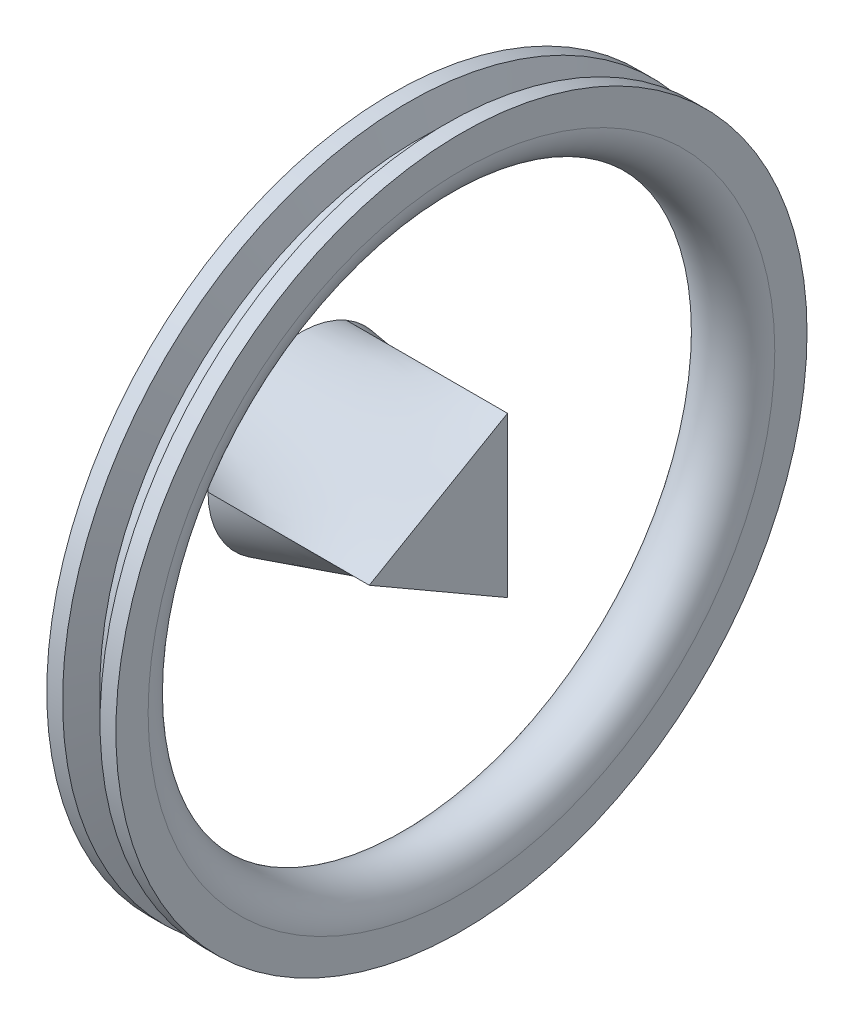
ISO-10303-21;
HEADER;
FILE_DESCRIPTION(('STEP AP214'),'2;1');
FILE_NAME('part.step','',(''),(''),'','','');
FILE_SCHEMA(('AUTOMOTIVE_DESIGN { 1 0 10303 214 1 1 1 1 }'));
ENDSEC;
DATA;
#1=APPLICATION_CONTEXT('core data for automotive mechanical design processes');
#2=APPLICATION_PROTOCOL_DEFINITION('international standard','automotive_design',2000,#1);
#3=PRODUCT_CONTEXT('',#1,'mechanical');
#4=PRODUCT('Part','Part','',(#3));
#5=PRODUCT_RELATED_PRODUCT_CATEGORY('part','',(#4));
#6=PRODUCT_DEFINITION_FORMATION('','',#4);
#7=PRODUCT_DEFINITION_CONTEXT('part definition',#1,'design');
#8=PRODUCT_DEFINITION('design','',#6,#7);
#9=PRODUCT_DEFINITION_SHAPE('','',#8);
#10=(LENGTH_UNIT() NAMED_UNIT(*) SI_UNIT(.MILLI.,.METRE.));
#11=(NAMED_UNIT(*) PLANE_ANGLE_UNIT() SI_UNIT($,.RADIAN.));
#12=(NAMED_UNIT(*) SI_UNIT($,.STERADIAN.) SOLID_ANGLE_UNIT());
#13=UNCERTAINTY_MEASURE_WITH_UNIT(LENGTH_MEASURE(1.E-05),#10,'distance_accuracy_value','');
#14=(GEOMETRIC_REPRESENTATION_CONTEXT(3) GLOBAL_UNCERTAINTY_ASSIGNED_CONTEXT((#13)) GLOBAL_UNIT_ASSIGNED_CONTEXT((#10,
#11,#12)) REPRESENTATION_CONTEXT('',''));
#15=CARTESIAN_POINT('',(0.,0.,0.));
#16=DIRECTION('',(0.,0.,1.));
#17=DIRECTION('',(1.,0.,0.));
#18=AXIS2_PLACEMENT_3D('',#15,#16,#17);
#19=CARTESIAN_POINT('',(20.,0.,75.));
#20=DIRECTION('',(1.,0.,0.));
#21=DIRECTION('',(0.,0.,-1.));
#22=AXIS2_PLACEMENT_3D('',#19,#20,#21);
#23=PLANE('',#22);
#24=CARTESIAN_POINT('',(20.,0.,0.));
#25=DIRECTION('',(1.,0.,0.));
#26=DIRECTION('',(0.,0.,-1.));
#27=AXIS2_PLACEMENT_3D('',#24,#25,#26);
#28=CIRCLE('',#27,75.);
#29=CARTESIAN_POINT('',(20.,0.,-75.));
#30=VERTEX_POINT('',#29);
#31=EDGE_CURVE('E92',#30,#30,#28,.T.);
#32=ORIENTED_EDGE('',*,*,#31,.F.);
#33=EDGE_LOOP('',(#32));
#34=FACE_BOUND('',#33,.T.);
#35=CARTESIAN_POINT('',(20.,0.,0.));
#36=DIRECTION('',(1.,0.,0.));
#37=DIRECTION('',(0.,0.,-1.));
#38=AXIS2_PLACEMENT_3D('',#35,#36,#37);
#39=CIRCLE('',#38,68.);
#40=CARTESIAN_POINT('',(20.,0.,-68.));
#41=VERTEX_POINT('',#40);
#42=EDGE_CURVE('E12',#41,#41,#39,.T.);
#43=ORIENTED_EDGE('',*,*,#42,.T.);
#44=EDGE_LOOP('',(#43));
#45=FACE_BOUND('',#44,.T.);
#46=ADVANCED_FACE('F64',(#34,#45),#23,.F.);
#47=CARTESIAN_POINT('',(27.5,0.,0.));
#48=DIRECTION('',(1.,0.,0.));
#49=DIRECTION('',(0.,0.,-1.));
#50=AXIS2_PLACEMENT_3D('',#47,#48,#49);
#51=TOROIDAL_SURFACE('',#50,68.,7.5);
#52=ORIENTED_EDGE('',*,*,#42,.F.);
#53=EDGE_LOOP('',(#52));
#54=FACE_BOUND('',#53,.T.);
#55=CARTESIAN_POINT('',(35.,0.,0.));
#56=DIRECTION('',(1.,0.,0.));
#57=DIRECTION('',(0.,0.,-1.));
#58=AXIS2_PLACEMENT_3D('',#55,#56,#57);
#59=CIRCLE('',#58,68.);
#60=CARTESIAN_POINT('',(35.,0.,-68.));
#61=VERTEX_POINT('',#60);
#62=EDGE_CURVE('E70',#61,#61,#59,.T.);
#63=ORIENTED_EDGE('',*,*,#62,.T.);
#64=EDGE_LOOP('',(#63));
#65=FACE_BOUND('',#64,.T.);
#66=ADVANCED_FACE('F99',(#54,#65),#51,.T.);
#67=CARTESIAN_POINT('',(35.,0.,75.));
#68=DIRECTION('',(-1.,0.,0.));
#69=DIRECTION('',(0.,0.,1.));
#70=AXIS2_PLACEMENT_3D('',#67,#68,#69);
#71=PLANE('',#70);
#72=ORIENTED_EDGE('',*,*,#62,.F.);
#73=EDGE_LOOP('',(#72));
#74=FACE_BOUND('',#73,.T.);
#75=CARTESIAN_POINT('',(35.,0.,0.));
#76=DIRECTION('',(1.,0.,0.));
#77=DIRECTION('',(0.,0.,-1.));
#78=AXIS2_PLACEMENT_3D('',#75,#76,#77);
#79=CIRCLE('',#78,75.);
#80=CARTESIAN_POINT('',(35.,0.,-75.));
#81=VERTEX_POINT('',#80);
#82=EDGE_CURVE('E74',#81,#81,#79,.T.);
#83=ORIENTED_EDGE('',*,*,#82,.T.);
#84=EDGE_LOOP('',(#83));
#85=FACE_BOUND('',#84,.T.);
#86=ADVANCED_FACE('F103',(#74,#85),#71,.F.);
#87=CARTESIAN_POINT('',(47.8941825318175,0.,0.));
#88=DIRECTION('',(1.,0.,0.));
#89=DIRECTION('',(0.,0.,-1.));
#90=AXIS2_PLACEMENT_3D('',#87,#88,#89);
#91=CYLINDRICAL_SURFACE('',#90,75.);
#92=ORIENTED_EDGE('',*,*,#82,.F.);
#93=EDGE_LOOP('',(#92));
#94=FACE_BOUND('',#93,.T.);
#95=CARTESIAN_POINT('',(31.565965679738,0.,0.));
#96=DIRECTION('',(1.,0.,0.));
#97=DIRECTION('',(0.,0.,-1.));
#98=AXIS2_PLACEMENT_3D('',#95,#96,#97);
#99=CIRCLE('',#98,75.);
#100=CARTESIAN_POINT('',(31.565965679738,0.,-75.));
#101=VERTEX_POINT('',#100);
#102=EDGE_CURVE('E78',#101,#101,#99,.T.);
#103=ORIENTED_EDGE('',*,*,#102,.T.);
#104=EDGE_LOOP('',(#103));
#105=FACE_BOUND('',#104,.T.);
#106=ADVANCED_FACE('F108',(#94,#105),#91,.T.);
#107=CARTESIAN_POINT('',(29.5,0.,0.));
#108=DIRECTION('',(1.,0.,0.));
#109=DIRECTION('',(0.,0.,-1.));
#110=AXIS2_PLACEMENT_3D('',#107,#108,#109);
#111=CONICAL_SURFACE('',#110,69.,1.23918376891598);
#112=ORIENTED_EDGE('',*,*,#102,.F.);
#113=EDGE_LOOP('',(#112));
#114=FACE_BOUND('',#113,.T.);
#115=CARTESIAN_POINT('',(29.5,0.,0.));
#116=DIRECTION('',(1.,0.,0.));
#117=DIRECTION('',(0.,0.,-1.));
#118=AXIS2_PLACEMENT_3D('',#115,#116,#117);
#119=CIRCLE('',#118,69.);
#120=CARTESIAN_POINT('',(29.5,0.,-69.));
#121=VERTEX_POINT('',#120);
#122=EDGE_CURVE('E83',#121,#121,#119,.T.);
#123=ORIENTED_EDGE('',*,*,#122,.T.);
#124=EDGE_LOOP('',(#123));
#125=FACE_BOUND('',#124,.T.);
#126=ADVANCED_FACE('F114',(#114,#125),#111,.T.);
#127=CARTESIAN_POINT('',(47.8941825318175,0.,0.));
#128=DIRECTION('',(1.,0.,0.));
#129=DIRECTION('',(0.,0.,-1.));
#130=AXIS2_PLACEMENT_3D('',#127,#128,#129);
#131=CYLINDRICAL_SURFACE('',#130,69.);
#132=ORIENTED_EDGE('',*,*,#122,.F.);
#133=EDGE_LOOP('',(#132));
#134=FACE_BOUND('',#133,.T.);
#135=CARTESIAN_POINT('',(25.5,0.,0.));
#136=DIRECTION('',(1.,0.,0.));
#137=DIRECTION('',(0.,0.,-1.));
#138=AXIS2_PLACEMENT_3D('',#135,#136,#137);
#139=CIRCLE('',#138,69.);
#140=CARTESIAN_POINT('',(25.5,0.,-69.));
#141=VERTEX_POINT('',#140);
#142=EDGE_CURVE('E86',#141,#141,#139,.T.);
#143=ORIENTED_EDGE('',*,*,#142,.T.);
#144=EDGE_LOOP('',(#143));
#145=FACE_BOUND('',#144,.T.);
#146=ADVANCED_FACE('F118',(#134,#145),#131,.T.);
#147=CARTESIAN_POINT('',(23.434034320262,0.,0.));
#148=DIRECTION('',(-1.,0.,0.));
#149=DIRECTION('',(0.,0.,1.));
#150=AXIS2_PLACEMENT_3D('',#147,#148,#149);
#151=CONICAL_SURFACE('',#150,75.,1.23918376891598);
#152=ORIENTED_EDGE('',*,*,#142,.F.);
#153=EDGE_LOOP('',(#152));
#154=FACE_BOUND('',#153,.T.);
#155=CARTESIAN_POINT('',(23.434034320262,0.,0.));
#156=DIRECTION('',(1.,0.,0.));
#157=DIRECTION('',(0.,0.,-1.));
#158=AXIS2_PLACEMENT_3D('',#155,#156,#157);
#159=CIRCLE('',#158,75.);
#160=CARTESIAN_POINT('',(23.434034320262,0.,-75.));
#161=VERTEX_POINT('',#160);
#162=EDGE_CURVE('E89',#161,#161,#159,.T.);
#163=ORIENTED_EDGE('',*,*,#162,.T.);
#164=EDGE_LOOP('',(#163));
#165=FACE_BOUND('',#164,.T.);
#166=ADVANCED_FACE('F122',(#154,#165),#151,.T.);
#167=CARTESIAN_POINT('',(47.8941825318175,0.,0.));
#168=DIRECTION('',(1.,0.,0.));
#169=DIRECTION('',(0.,0.,-1.));
#170=AXIS2_PLACEMENT_3D('',#167,#168,#169);
#171=CYLINDRICAL_SURFACE('',#170,75.);
#172=ORIENTED_EDGE('',*,*,#162,.F.);
#173=EDGE_LOOP('',(#172));
#174=FACE_BOUND('',#173,.T.);
#175=ORIENTED_EDGE('',*,*,#31,.T.);
#176=EDGE_LOOP('',(#175));
#177=FACE_BOUND('',#176,.T.);
#178=ADVANCED_FACE('F96',(#174,#177),#171,.T.);
#179=CLOSED_SHELL('',(#46,#66,#86,#106,#126,#146,#166,#178));
#180=MANIFOLD_SOLID_BREP('B2',#179);
#181=CARTESIAN_POINT('',(35.,0.,0.));
#182=DIRECTION('',(1.,0.,0.));
#183=DIRECTION('',(0.,0.,-1.));
#184=AXIS2_PLACEMENT_3D('',#181,#182,#183);
#185=PLANE('',#184);
#186=DIRECTION('',(0.,-0.5,0.866025403784439));
#187=VECTOR('',#186,1.);
#188=CARTESIAN_POINT('',(35.,17.3205080756887,-9.99999999999996));
#189=LINE('',#188,#187);
#190=CARTESIAN_POINT('',(35.,17.3205080756887,-9.99999999999996));
#191=VERTEX_POINT('',#190);
#192=CARTESIAN_POINT('',(35.,0.,19.9999999999999));
#193=VERTEX_POINT('',#192);
#194=EDGE_CURVE('E249',#191,#193,#189,.T.);
#195=ORIENTED_EDGE('',*,*,#194,.T.);
#196=DIRECTION('',(0.,-0.5,-0.866025403784439));
#197=VECTOR('',#196,1.);
#198=CARTESIAN_POINT('',(35.,0.,19.9999999999999));
#199=LINE('',#198,#197);
#200=CARTESIAN_POINT('',(35.,-17.3205080756887,-9.99999999999996));
#201=VERTEX_POINT('',#200);
#202=EDGE_CURVE('E196',#193,#201,#199,.T.);
#203=ORIENTED_EDGE('',*,*,#202,.T.);
#204=DIRECTION('',(0.,1.,0.));
#205=VECTOR('',#204,1.);
#206=CARTESIAN_POINT('',(35.,-17.3205080756887,-9.99999999999996));
#207=LINE('',#206,#205);
#208=EDGE_CURVE('E62',#201,#191,#207,.T.);
#209=ORIENTED_EDGE('',*,*,#208,.T.);
#210=EDGE_LOOP('',(#195,#203,#209));
#211=FACE_BOUND('',#210,.T.);
#212=ADVANCED_FACE('F186',(#211),#185,.T.);
#213=CARTESIAN_POINT('',(0.,0.,0.));
#214=DIRECTION('',(1.,0.,0.));
#215=DIRECTION('',(0.,0.,-1.));
#216=AXIS2_PLACEMENT_3D('',#213,#214,#215);
#217=PLANE('',#216);
#218=CARTESIAN_POINT('',(0.,0.,0.));
#219=DIRECTION('',(1.,0.,0.));
#220=DIRECTION('',(0.,0.,-1.));
#221=AXIS2_PLACEMENT_3D('',#218,#219,#220);
#222=CIRCLE('',#221,20.);
#223=CARTESIAN_POINT('',(0.,17.3205080756888,-10.));
#224=VERTEX_POINT('',#223);
#225=CARTESIAN_POINT('',(0.,0.,20.));
#226=VERTEX_POINT('',#225);
#227=EDGE_CURVE('E225',#224,#226,#222,.T.);
#228=ORIENTED_EDGE('',*,*,#227,.F.);
#229=CARTESIAN_POINT('',(0.,-17.3205080756888,-10.));
#230=VERTEX_POINT('',#229);
#231=EDGE_CURVE('E229',#230,#224,#222,.T.);
#232=ORIENTED_EDGE('',*,*,#231,.F.);
#233=EDGE_CURVE('E231',#226,#230,#222,.T.);
#234=ORIENTED_EDGE('',*,*,#233,.F.);
#235=EDGE_LOOP('',(#228,#232,#234));
#236=FACE_BOUND('',#235,.T.);
#237=ADVANCED_FACE('F228',(#236),#217,.F.);
#238=CARTESIAN_POINT('',(0.,0.,20.));
#239=CARTESIAN_POINT('',(35.,0.,19.9999999999999));
#240=CARTESIAN_POINT('',(0.,-1.44337567297406,20.));
#241=CARTESIAN_POINT('',(35.,-0.721687836487032,18.7499999999999));
#242=CARTESIAN_POINT('',(0.,-2.98004432573408,19.8430286241921));
#243=CARTESIAN_POINT('',(35.,-1.44337567297406,17.4999999999999));
#244=CARTESIAN_POINT('',(0.,-6.13601255620738,19.1043397968606));
#245=CARTESIAN_POINT('',(35.,-2.88675134594812,14.9999999999999));
#246=CARTESIAN_POINT('',(0.,-7.75494148556479,18.5207100591716));
#247=CARTESIAN_POINT('',(35.,-3.60843918243514,13.75));
#248=CARTESIAN_POINT('',(0.,-10.897913365177,16.8639053254438));
#249=CARTESIAN_POINT('',(35.,-5.0518148554092,11.25));
#250=CARTESIAN_POINT('',(0.,-12.4198839665323,15.7892544773011));
#251=CARTESIAN_POINT('',(35.,-5.77350269189623,9.99999999999998));
#252=CARTESIAN_POINT('',(0.,-14.4686237805663,13.8400666389005));
#253=CARTESIAN_POINT('',(35.,-6.85603444662677,8.12499999999998));
#254=CARTESIAN_POINT('',(0.,-15.1124133792203,13.1351177212811));
#255=CARTESIAN_POINT('',(35.,-7.21687836487028,7.49999999999999));
#256=CARTESIAN_POINT('',(0.,-16.2978344264329,11.6317216569572));
#257=CARTESIAN_POINT('',(35.,-7.93856620135731,6.24999999999999));
#258=CARTESIAN_POINT('',(0.,-16.8393828513641,10.8333333333333));
#259=CARTESIAN_POINT('',(35.,-8.29941011960083,5.62499999999999));
#260=CARTESIAN_POINT('',(0.,-17.8016333000135,9.16666666666667));
#261=CARTESIAN_POINT('',(35.,-9.02109795608786,4.375));
#262=CARTESIAN_POINT('',(0.,-18.2222836578911,8.29847781148487));
#263=CARTESIAN_POINT('',(35.,-9.38194187433137,3.75));
#264=CARTESIAN_POINT('',(0.,-18.9315523179388,6.52017503825606));
#265=CARTESIAN_POINT('',(35.,-10.1036297108184,2.50000000000001));
#266=CARTESIAN_POINT('',(0.,-19.2201611896405,5.61016243231987));
#267=CARTESIAN_POINT('',(35.,-10.4644736290619,1.87500000000001));
#268=CARTESIAN_POINT('',(0.,-19.8838374674261,2.86130778842149));
#269=CARTESIAN_POINT('',(35.,-11.5470053837925,0.));
#270=CARTESIAN_POINT('',(0.,-20.0535271014385,1.00591715976331));
#271=CARTESIAN_POINT('',(35.,-12.2686932202795,-1.24999999999998));
#272=CARTESIAN_POINT('',(0.,-19.916876150151,-2.54437869822485));
#273=CARTESIAN_POINT('',(35.,-13.7120688932535,-3.74999999999997));
#274=CARTESIAN_POINT('',(0.,-19.612849864715,-4.23822714681441));
#275=CARTESIAN_POINT('',(35.,-14.4337567297406,-4.99999999999997));
#276=CARTESIAN_POINT('',(0.,-18.6745890394391,-7.34072022160665));
#277=CARTESIAN_POINT('',(35.,-15.8771324027146,-7.49999999999996));
#278=CARTESIAN_POINT('',(0.,-18.0421959121758,-8.75000000000001));
#279=CARTESIAN_POINT('',(35.,-16.5988202392017,-8.74999999999996));
#280=CARTESIAN_POINT('',(0.,-17.3205080756888,-10.));
#281=CARTESIAN_POINT('',(35.,-17.3205080756887,-9.99999999999996));
#282=B_SPLINE_SURFACE_WITH_KNOTS('',3,1,((#238,#239),(#240,#241),(#242,#243),(#244,#245),(#246,
#247),(#248,#249),(#250,#251),(#252,#253),(#254,#255),(#256,#257),(#258,#259),(#260,#261),(#262,
#263),(#264,#265),(#266,#267),(#268,#269),(#270,#271),(#272,#273),(#274,#275),(#276,#277),(#278,
#279),(#280,#281)),.UNSPECIFIED.,.F.,.F.,.F.,(4,2,2,2,2,2,2,2,2,2,4),(2,2),(0.,0.125,0.25,0.375,
0.4375,0.5,0.5625,0.625,0.75,0.875,1.),(0.,1.),.UNSPECIFIED.);
#283=DIRECTION('',(1.,0.,0.));
#284=VECTOR('',#283,1.);
#285=CARTESIAN_POINT('',(17.5,-17.3205080756887,-9.99999999999998));
#286=LINE('',#285,#284);
#287=EDGE_CURVE('E211',#230,#201,#286,.T.);
#288=DIRECTION('',(-1.,0.,0.));
#289=VECTOR('',#288,1.);
#290=CARTESIAN_POINT('',(17.5,0.,20.));
#291=LINE('',#290,#289);
#292=EDGE_CURVE('E237',#193,#226,#291,.T.);
#293=ORIENTED_EDGE('',*,*,#233,.T.);
#294=ORIENTED_EDGE('',*,*,#287,.T.);
#295=ORIENTED_EDGE('',*,*,#202,.F.);
#296=ORIENTED_EDGE('',*,*,#292,.T.);
#297=EDGE_LOOP('',(#293,#294,#295,#296));
#298=FACE_BOUND('',#297,.T.);
#299=ADVANCED_FACE('F278',(#298),#282,.T.);
#300=CARTESIAN_POINT('',(0.,-17.3205080756888,-10.));
#301=CARTESIAN_POINT('',(35.,-17.3205080756887,-9.99999999999996));
#302=CARTESIAN_POINT('',(0.,-16.5988202392017,-11.25));
#303=CARTESIAN_POINT('',(35.,-15.8771324027146,-9.99999999999996));
#304=CARTESIAN_POINT('',(0.,-15.6945447137051,-12.5023084025854));
#305=CARTESIAN_POINT('',(35.,-14.4337567297406,-9.99999999999996));
#306=CARTESIAN_POINT('',(0.,-13.4768373085076,-14.8661126500462));
#307=CARTESIAN_POINT('',(35.,-11.5470053837925,-9.99999999999996));
#308=CARTESIAN_POINT('',(0.,-12.1619346645862,-15.9763313609468));
#309=CARTESIAN_POINT('',(35.,-10.1036297108184,-9.99999999999996));
#310=CARTESIAN_POINT('',(0.,-9.15561373626152,-17.8698224852071));
#311=CARTESIAN_POINT('',(35.,-7.2168783648703,-9.99999999999996));
#312=CARTESIAN_POINT('',(0.,-7.46395350089379,-18.6505622657226));
#313=CARTESIAN_POINT('',(35.,-5.77350269189624,-9.99999999999996));
#314=CARTESIAN_POINT('',(0.,-4.75153740907414,-19.4502290712203));
#315=CARTESIAN_POINT('',(35.,-3.60843918243516,-9.99999999999996));
#316=CARTESIAN_POINT('',(0.,-3.81913893871846,-19.6552927595372));
#317=CARTESIAN_POINT('',(35.,-2.88675134594813,-9.99999999999996));
#318=CARTESIAN_POINT('',(0.,-1.92444923145814,-19.9301994684421));
#319=CARTESIAN_POINT('',(35.,-1.44337567297407,-9.99999999999996));
#320=CARTESIAN_POINT('',(0.,-0.96225044864938,-20.));
#321=CARTESIAN_POINT('',(35.,-0.721687836487046,-9.99999999999996));
#322=CARTESIAN_POINT('',(0.,0.962250448649372,-20.));
#323=CARTESIAN_POINT('',(35.,0.721687836487013,-9.99999999999996));
#324=CARTESIAN_POINT('',(0.,1.92444923145813,-19.9301994684421));
#325=CARTESIAN_POINT('',(35.,1.44337567297404,-9.99999999999996));
#326=CARTESIAN_POINT('',(0.,3.81913893871845,-19.6552927595372));
#327=CARTESIAN_POINT('',(35.,2.8867513459481,-9.99999999999996));
#328=CARTESIAN_POINT('',(0.,4.75153740907414,-19.4502290712203));
#329=CARTESIAN_POINT('',(35.,3.60843918243513,-9.99999999999996));
#330=CARTESIAN_POINT('',(0.,7.46395350089378,-18.6505622657226));
#331=CARTESIAN_POINT('',(35.,5.77350269189622,-9.99999999999996));
#332=CARTESIAN_POINT('',(0.,9.15561373626152,-17.8698224852071));
#333=CARTESIAN_POINT('',(35.,7.21687836487028,-9.99999999999996));
#334=CARTESIAN_POINT('',(0.,12.1619346645862,-15.9763313609468));
#335=CARTESIAN_POINT('',(35.,10.1036297108184,-9.99999999999996));
#336=CARTESIAN_POINT('',(0.,13.4768373085076,-14.8661126500462));
#337=CARTESIAN_POINT('',(35.,11.5470053837925,-9.99999999999996));
#338=CARTESIAN_POINT('',(0.,15.6945447137051,-12.5023084025854));
#339=CARTESIAN_POINT('',(35.,14.4337567297406,-9.99999999999996));
#340=CARTESIAN_POINT('',(0.,16.5988202392017,-11.25));
#341=CARTESIAN_POINT('',(35.,15.8771324027146,-9.99999999999996));
#342=CARTESIAN_POINT('',(0.,17.3205080756888,-10.));
#343=CARTESIAN_POINT('',(35.,17.3205080756887,-9.99999999999996));
#344=B_SPLINE_SURFACE_WITH_KNOTS('',3,1,((#300,#301),(#302,#303),(#304,#305),(#306,#307),(#308,
#309),(#310,#311),(#312,#313),(#314,#315),(#316,#317),(#318,#319),(#320,#321),(#322,#323),(#324,
#325),(#326,#327),(#328,#329),(#330,#331),(#332,#333),(#334,#335),(#336,#337),(#338,#339),(#340,
#341),(#342,#343)),.UNSPECIFIED.,.F.,.F.,.F.,(4,2,2,2,2,2,2,2,2,2,4),(2,2),(0.,0.125,0.25,0.375,
0.4375,0.5,0.5625,0.625,0.75,0.875,1.),(0.,1.),.UNSPECIFIED.);
#345=DIRECTION('',(1.,0.,0.));
#346=VECTOR('',#345,1.);
#347=CARTESIAN_POINT('',(17.5,17.3205080756887,-9.99999999999998));
#348=LINE('',#347,#346);
#349=EDGE_CURVE('E245',#224,#191,#348,.T.);
#350=ORIENTED_EDGE('',*,*,#231,.T.);
#351=ORIENTED_EDGE('',*,*,#349,.T.);
#352=ORIENTED_EDGE('',*,*,#208,.F.);
#353=ORIENTED_EDGE('',*,*,#287,.F.);
#354=EDGE_LOOP('',(#350,#351,#352,#353));
#355=FACE_BOUND('',#354,.T.);
#356=ADVANCED_FACE('F244',(#355),#344,.T.);
#357=CARTESIAN_POINT('',(0.,17.3205080756888,-10.));
#358=CARTESIAN_POINT('',(35.,17.3205080756887,-9.99999999999996));
#359=CARTESIAN_POINT('',(0.,18.0421959121758,-8.75));
#360=CARTESIAN_POINT('',(35.,16.5988202392017,-8.74999999999996));
#361=CARTESIAN_POINT('',(0.,18.6745890394391,-7.34072022160665));
#362=CARTESIAN_POINT('',(35.,15.8771324027146,-7.49999999999996));
#363=CARTESIAN_POINT('',(0.,19.612849864715,-4.23822714681441));
#364=CARTESIAN_POINT('',(35.,14.4337567297406,-4.99999999999997));
#365=CARTESIAN_POINT('',(0.,19.916876150151,-2.54437869822486));
#366=CARTESIAN_POINT('',(35.,13.7120688932535,-3.74999999999997));
#367=CARTESIAN_POINT('',(0.,20.0535271014385,1.00591715976331));
#368=CARTESIAN_POINT('',(35.,12.2686932202795,-1.24999999999998));
#369=CARTESIAN_POINT('',(0.,19.8838374674261,2.86130778842148));
#370=CARTESIAN_POINT('',(35.,11.5470053837924,0.));
#371=CARTESIAN_POINT('',(0.,19.2201611896405,5.61016243231986));
#372=CARTESIAN_POINT('',(35.,10.4644736290619,1.87500000000002));
#373=CARTESIAN_POINT('',(0.,18.9315523179388,6.52017503825606));
#374=CARTESIAN_POINT('',(35.,10.1036297108184,2.50000000000001));
#375=CARTESIAN_POINT('',(0.,18.2222836578911,8.29847781148487));
#376=CARTESIAN_POINT('',(35.,9.38194187433136,3.75));
#377=CARTESIAN_POINT('',(0.,17.8016333000135,9.16666666666666));
#378=CARTESIAN_POINT('',(35.,9.02109795608785,4.37499999999999));
#379=CARTESIAN_POINT('',(0.,16.8393828513641,10.8333333333333));
#380=CARTESIAN_POINT('',(35.,8.29941011960082,5.62499999999999));
#381=CARTESIAN_POINT('',(0.,16.2978344264329,11.6317216569572));
#382=CARTESIAN_POINT('',(35.,7.9385662013573,6.24999999999999));
#383=CARTESIAN_POINT('',(0.,15.1124133792203,13.1351177212811));
#384=CARTESIAN_POINT('',(35.,7.21687836487027,7.49999999999999));
#385=CARTESIAN_POINT('',(0.,14.4686237805663,13.8400666389004));
#386=CARTESIAN_POINT('',(35.,6.85603444662676,8.12499999999999));
#387=CARTESIAN_POINT('',(0.,12.4198839665323,15.7892544773011));
#388=CARTESIAN_POINT('',(35.,5.77350269189622,9.99999999999998));
#389=CARTESIAN_POINT('',(0.,10.897913365177,16.8639053254438));
#390=CARTESIAN_POINT('',(35.,5.05181485540919,11.25));
#391=CARTESIAN_POINT('',(0.,7.75494148556479,18.5207100591716));
#392=CARTESIAN_POINT('',(35.,3.60843918243513,13.75));
#393=CARTESIAN_POINT('',(0.,6.13601255620739,19.1043397968606));
#394=CARTESIAN_POINT('',(35.,2.8867513459481,15.));
#395=CARTESIAN_POINT('',(0.,2.98004432573409,19.8430286241921));
#396=CARTESIAN_POINT('',(35.,1.44337567297405,17.4999999999999));
#397=CARTESIAN_POINT('',(0.,1.44337567297407,20.));
#398=CARTESIAN_POINT('',(35.,0.721687836487021,18.7499999999999));
#399=CARTESIAN_POINT('',(0.,0.,20.));
#400=CARTESIAN_POINT('',(35.,0.,19.9999999999999));
#401=B_SPLINE_SURFACE_WITH_KNOTS('',3,1,((#357,#358),(#359,#360),(#361,#362),(#363,#364),(#365,
#366),(#367,#368),(#369,#370),(#371,#372),(#373,#374),(#375,#376),(#377,#378),(#379,#380),(#381,
#382),(#383,#384),(#385,#386),(#387,#388),(#389,#390),(#391,#392),(#393,#394),(#395,#396),(#397,
#398),(#399,#400)),.UNSPECIFIED.,.F.,.F.,.F.,(4,2,2,2,2,2,2,2,2,2,4),(2,2),(0.,0.125,0.25,
0.375000000000001,0.437500000000001,0.500000000000001,0.562500000000001,0.625000000000001,0.75,
0.875,1.),(0.,1.),.UNSPECIFIED.);
#402=ORIENTED_EDGE('',*,*,#227,.T.);
#403=ORIENTED_EDGE('',*,*,#292,.F.);
#404=ORIENTED_EDGE('',*,*,#194,.F.);
#405=ORIENTED_EDGE('',*,*,#349,.F.);
#406=EDGE_LOOP('',(#402,#403,#404,#405));
#407=FACE_BOUND('',#406,.T.);
#408=ADVANCED_FACE('F248',(#407),#401,.T.);
#409=CLOSED_SHELL('',(#212,#237,#299,#356,#408));
#410=MANIFOLD_SOLID_BREP('B7',#409);
#411=ADVANCED_BREP_SHAPE_REPRESENTATION('',(#18,#180,#410),#14);
#412=SHAPE_DEFINITION_REPRESENTATION(#9,#411);
ENDSEC;
END-ISO-10303-21;
